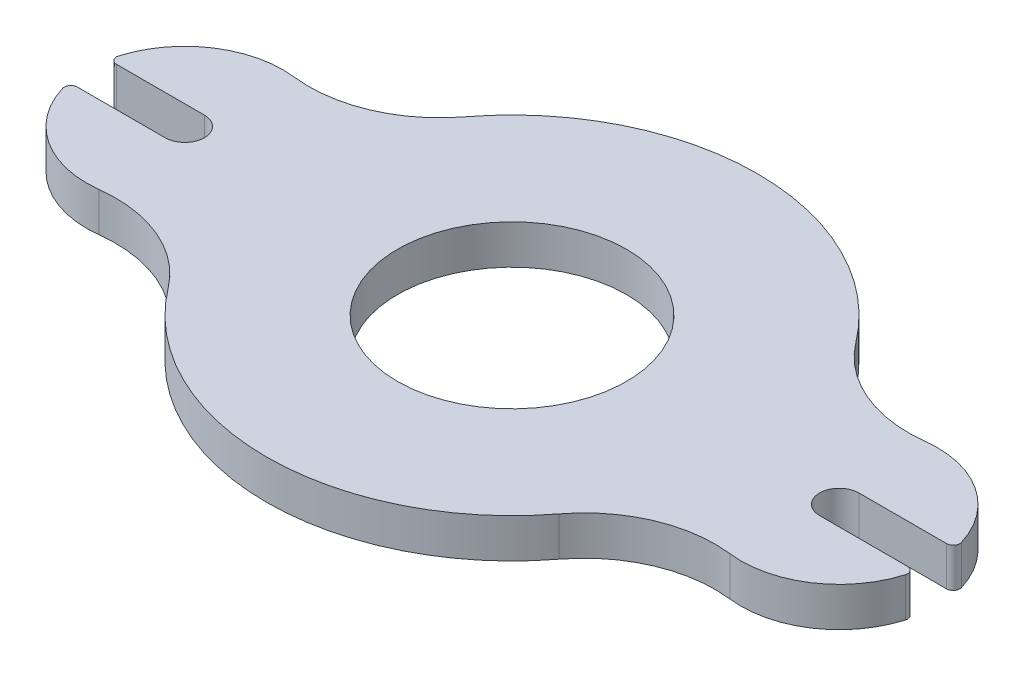
ISO-10303-21;
HEADER;
FILE_DESCRIPTION(('STEP AP214'),'2;1');
FILE_NAME('part.step','',(''),(''),'','','');
FILE_SCHEMA(('AUTOMOTIVE_DESIGN { 1 0 10303 214 1 1 1 1 }'));
ENDSEC;
DATA;
#1=APPLICATION_CONTEXT('core data for automotive mechanical design processes');
#2=APPLICATION_PROTOCOL_DEFINITION('international standard','automotive_design',2000,#1);
#3=PRODUCT_CONTEXT('',#1,'mechanical');
#4=PRODUCT('Part','Part','',(#3));
#5=PRODUCT_RELATED_PRODUCT_CATEGORY('part','',(#4));
#6=PRODUCT_DEFINITION_FORMATION('','',#4);
#7=PRODUCT_DEFINITION_CONTEXT('part definition',#1,'design');
#8=PRODUCT_DEFINITION('design','',#6,#7);
#9=PRODUCT_DEFINITION_SHAPE('','',#8);
#10=(LENGTH_UNIT() NAMED_UNIT(*) SI_UNIT(.MILLI.,.METRE.));
#11=(NAMED_UNIT(*) PLANE_ANGLE_UNIT() SI_UNIT($,.RADIAN.));
#12=(NAMED_UNIT(*) SI_UNIT($,.STERADIAN.) SOLID_ANGLE_UNIT());
#13=UNCERTAINTY_MEASURE_WITH_UNIT(LENGTH_MEASURE(1.E-05),#10,'distance_accuracy_value','');
#14=(GEOMETRIC_REPRESENTATION_CONTEXT(3) GLOBAL_UNCERTAINTY_ASSIGNED_CONTEXT((#13)) GLOBAL_UNIT_ASSIGNED_CONTEXT((#10,
#11,#12)) REPRESENTATION_CONTEXT('',''));
#15=CARTESIAN_POINT('',(0.,0.,0.));
#16=DIRECTION('',(0.,0.,1.));
#17=DIRECTION('',(1.,0.,0.));
#18=AXIS2_PLACEMENT_3D('',#15,#16,#17);
#19=CARTESIAN_POINT('',(50.,6.,0.));
#20=DIRECTION('',(0.,-1.,0.));
#21=DIRECTION('',(0.,0.,-1.));
#22=AXIS2_PLACEMENT_3D('',#19,#20,#21);
#23=PLANE('',#22);
#24=CARTESIAN_POINT('',(50.,6.,0.));
#25=DIRECTION('',(0.,-1.,0.));
#26=DIRECTION('',(0.,0.,-1.));
#27=AXIS2_PLACEMENT_3D('',#24,#25,#26);
#28=CIRCLE('',#27,3.);
#29=CARTESIAN_POINT('',(50.,6.,3.));
#30=VERTEX_POINT('',#29);
#31=CARTESIAN_POINT('',(50.,6.,-3.));
#32=VERTEX_POINT('',#31);
#33=EDGE_CURVE('E240',#30,#32,#28,.T.);
#34=ORIENTED_EDGE('',*,*,#33,.T.);
#35=DIRECTION('',(1.,0.,0.));
#36=VECTOR('',#35,1.);
#37=CARTESIAN_POINT('',(50.,6.,-3.));
#38=LINE('',#37,#36);
#39=CARTESIAN_POINT('',(63.4164078649987,6.,-3.00000000000001));
#40=VERTEX_POINT('',#39);
#41=EDGE_CURVE('E128',#32,#40,#38,.T.);
#42=ORIENTED_EDGE('',*,*,#41,.T.);
#43=CARTESIAN_POINT('',(63.4164078649987,6.,-4.00000000000002));
#44=DIRECTION('',(0.,1.,0.));
#45=DIRECTION('',(0.,0.,-1.));
#46=AXIS2_PLACEMENT_3D('',#43,#44,#45);
#47=CIRCLE('',#46,1.00000000000001);
#48=CARTESIAN_POINT('',(64.3747227124986,6.,-4.2857142857143));
#49=VERTEX_POINT('',#48);
#50=EDGE_CURVE('E291',#40,#49,#47,.T.);
#51=ORIENTED_EDGE('',*,*,#50,.T.);
#52=CARTESIAN_POINT('',(50.,6.,0.));
#53=DIRECTION('',(0.,1.,0.));
#54=DIRECTION('',(0.,0.,-1.));
#55=AXIS2_PLACEMENT_3D('',#52,#53,#54);
#56=CIRCLE('',#55,15.);
#57=CARTESIAN_POINT('',(48.2053571428571,6.,-14.8922549338677));
#58=VERTEX_POINT('',#57);
#59=EDGE_CURVE('E310',#49,#58,#56,.T.);
#60=ORIENTED_EDGE('',*,*,#59,.T.);
#61=CARTESIAN_POINT('',(45.8125,6.,-34.7485948456912));
#62=DIRECTION('',(0.,-1.,0.));
#63=DIRECTION('',(0.,0.,-1.));
#64=AXIS2_PLACEMENT_3D('',#61,#62,#63);
#65=CIRCLE('',#64,20.);
#66=CARTESIAN_POINT('',(29.8777173913043,6.,-22.6621270732769));
#67=VERTEX_POINT('',#66);
#68=EDGE_CURVE('E307',#58,#67,#65,.T.);
#69=ORIENTED_EDGE('',*,*,#68,.T.);
#70=CARTESIAN_POINT('',(0.,6.,0.));
#71=DIRECTION('',(0.,1.,0.));
#72=DIRECTION('',(0.,0.,1.));
#73=AXIS2_PLACEMENT_3D('',#70,#71,#72);
#74=CIRCLE('',#73,37.5);
#75=CARTESIAN_POINT('',(-29.8777173913044,6.,-22.6621270732769));
#76=VERTEX_POINT('',#75);
#77=EDGE_CURVE('E309',#67,#76,#74,.T.);
#78=ORIENTED_EDGE('',*,*,#77,.T.);
#79=CARTESIAN_POINT('',(-45.8125,6.,-34.7485948456912));
#80=DIRECTION('',(0.,-1.,0.));
#81=DIRECTION('',(0.,0.,-1.));
#82=AXIS2_PLACEMENT_3D('',#79,#80,#81);
#83=CIRCLE('',#82,20.);
#84=CARTESIAN_POINT('',(-48.2053571428571,6.,-14.8922549338677));
#85=VERTEX_POINT('',#84);
#86=EDGE_CURVE('E312',#76,#85,#83,.T.);
#87=ORIENTED_EDGE('',*,*,#86,.T.);
#88=CARTESIAN_POINT('',(-50.,6.,0.));
#89=DIRECTION('',(0.,1.,0.));
#90=DIRECTION('',(0.,0.,1.));
#91=AXIS2_PLACEMENT_3D('',#88,#89,#90);
#92=CIRCLE('',#91,15.);
#93=CARTESIAN_POINT('',(-64.3747227124987,6.,-4.28571428571431));
#94=VERTEX_POINT('',#93);
#95=EDGE_CURVE('E318',#85,#94,#92,.T.);
#96=ORIENTED_EDGE('',*,*,#95,.T.);
#97=CARTESIAN_POINT('',(-63.4164078649987,6.,-4.00000000000002));
#98=DIRECTION('',(0.,1.,0.));
#99=DIRECTION('',(0.,0.,1.));
#100=AXIS2_PLACEMENT_3D('',#97,#98,#99);
#101=CIRCLE('',#100,1.00000000000001);
#102=CARTESIAN_POINT('',(-63.4164078649987,6.,-3.));
#103=VERTEX_POINT('',#102);
#104=EDGE_CURVE('E320',#94,#103,#101,.T.);
#105=ORIENTED_EDGE('',*,*,#104,.T.);
#106=DIRECTION('',(1.,0.,0.));
#107=VECTOR('',#106,1.);
#108=CARTESIAN_POINT('',(-50.,6.,-3.));
#109=LINE('',#108,#107);
#110=CARTESIAN_POINT('',(-50.,6.,-3.));
#111=VERTEX_POINT('',#110);
#112=EDGE_CURVE('E322',#103,#111,#109,.T.);
#113=ORIENTED_EDGE('',*,*,#112,.T.);
#114=CARTESIAN_POINT('',(-50.,6.,0.));
#115=DIRECTION('',(0.,-1.,0.));
#116=DIRECTION('',(0.,0.,1.));
#117=AXIS2_PLACEMENT_3D('',#114,#115,#116);
#118=CIRCLE('',#117,3.);
#119=CARTESIAN_POINT('',(-50.,6.,3.));
#120=VERTEX_POINT('',#119);
#121=EDGE_CURVE('E324',#111,#120,#118,.T.);
#122=ORIENTED_EDGE('',*,*,#121,.T.);
#123=DIRECTION('',(-1.,0.,0.));
#124=VECTOR('',#123,1.);
#125=CARTESIAN_POINT('',(-50.,6.,3.));
#126=LINE('',#125,#124);
#127=CARTESIAN_POINT('',(-63.4164078649987,6.,3.));
#128=VERTEX_POINT('',#127);
#129=EDGE_CURVE('E326',#120,#128,#126,.T.);
#130=ORIENTED_EDGE('',*,*,#129,.T.);
#131=CARTESIAN_POINT('',(-63.4164078649987,6.,4.));
#132=DIRECTION('',(0.,1.,0.));
#133=DIRECTION('',(0.,0.,1.));
#134=AXIS2_PLACEMENT_3D('',#131,#132,#133);
#135=CIRCLE('',#134,1.00000000000001);
#136=CARTESIAN_POINT('',(-64.3747227124987,6.,4.28571428571429));
#137=VERTEX_POINT('',#136);
#138=EDGE_CURVE('E328',#128,#137,#135,.T.);
#139=ORIENTED_EDGE('',*,*,#138,.T.);
#140=CARTESIAN_POINT('',(-50.,6.,0.));
#141=DIRECTION('',(0.,1.,0.));
#142=DIRECTION('',(0.,0.,1.));
#143=AXIS2_PLACEMENT_3D('',#140,#141,#142);
#144=CIRCLE('',#143,15.);
#145=CARTESIAN_POINT('',(-48.2053571428571,6.,14.8922549338677));
#146=VERTEX_POINT('',#145);
#147=EDGE_CURVE('E330',#137,#146,#144,.T.);
#148=ORIENTED_EDGE('',*,*,#147,.T.);
#149=CARTESIAN_POINT('',(-45.8125,6.,34.7485948456912));
#150=DIRECTION('',(0.,-1.,0.));
#151=DIRECTION('',(0.,0.,1.));
#152=AXIS2_PLACEMENT_3D('',#149,#150,#151);
#153=CIRCLE('',#152,20.);
#154=CARTESIAN_POINT('',(-29.8777173913044,6.,22.6621270732769));
#155=VERTEX_POINT('',#154);
#156=EDGE_CURVE('E332',#146,#155,#153,.T.);
#157=ORIENTED_EDGE('',*,*,#156,.T.);
#158=CARTESIAN_POINT('',(0.,6.,0.));
#159=DIRECTION('',(0.,1.,0.));
#160=DIRECTION('',(0.,0.,1.));
#161=AXIS2_PLACEMENT_3D('',#158,#159,#160);
#162=CIRCLE('',#161,37.5);
#163=CARTESIAN_POINT('',(29.8777173913043,6.,22.6621270732769));
#164=VERTEX_POINT('',#163);
#165=EDGE_CURVE('E334',#155,#164,#162,.T.);
#166=ORIENTED_EDGE('',*,*,#165,.T.);
#167=CARTESIAN_POINT('',(45.8125,6.,34.7485948456912));
#168=DIRECTION('',(0.,-1.,0.));
#169=DIRECTION('',(0.,0.,-1.));
#170=AXIS2_PLACEMENT_3D('',#167,#168,#169);
#171=CIRCLE('',#170,20.);
#172=CARTESIAN_POINT('',(48.2053571428572,6.,14.8922549338677));
#173=VERTEX_POINT('',#172);
#174=EDGE_CURVE('E183',#164,#173,#171,.T.);
#175=ORIENTED_EDGE('',*,*,#174,.T.);
#176=CARTESIAN_POINT('',(50.,6.,0.));
#177=DIRECTION('',(0.,1.,0.));
#178=DIRECTION('',(0.,0.,-1.));
#179=AXIS2_PLACEMENT_3D('',#176,#177,#178);
#180=CIRCLE('',#179,15.);
#181=CARTESIAN_POINT('',(64.3747227124987,6.,4.28571428571429));
#182=VERTEX_POINT('',#181);
#183=EDGE_CURVE('E177',#173,#182,#180,.T.);
#184=ORIENTED_EDGE('',*,*,#183,.T.);
#185=CARTESIAN_POINT('',(63.4164078649987,6.,4.));
#186=DIRECTION('',(0.,1.,0.));
#187=DIRECTION('',(0.,0.,-1.));
#188=AXIS2_PLACEMENT_3D('',#185,#186,#187);
#189=CIRCLE('',#188,1.00000000000001);
#190=CARTESIAN_POINT('',(63.4164078649987,6.,3.));
#191=VERTEX_POINT('',#190);
#192=EDGE_CURVE('E181',#182,#191,#189,.T.);
#193=ORIENTED_EDGE('',*,*,#192,.T.);
#194=DIRECTION('',(-1.,0.,0.));
#195=VECTOR('',#194,1.);
#196=CARTESIAN_POINT('',(50.,6.,3.));
#197=LINE('',#196,#195);
#198=EDGE_CURVE('E49',#191,#30,#197,.T.);
#199=ORIENTED_EDGE('',*,*,#198,.T.);
#200=EDGE_LOOP('',(#34,#42,#51,#60,#69,#78,#87,#96,#105,#113,#122,#130,#139,#148,#157,#166,#175,
#184,#193,#199));
#201=FACE_BOUND('',#200,.T.);
#202=CARTESIAN_POINT('',(0.,6.,0.));
#203=DIRECTION('',(0.,1.,0.));
#204=DIRECTION('',(0.,0.,1.));
#205=AXIS2_PLACEMENT_3D('',#202,#203,#204);
#206=CIRCLE('',#205,17.5);
#207=CARTESIAN_POINT('',(0.,6.,17.5));
#208=VERTEX_POINT('',#207);
#209=EDGE_CURVE('E205',#208,#208,#206,.T.);
#210=ORIENTED_EDGE('',*,*,#209,.F.);
#211=EDGE_LOOP('',(#210));
#212=FACE_BOUND('',#211,.T.);
#213=ADVANCED_FACE('F32',(#201,#212),#23,.F.);
#214=CARTESIAN_POINT('',(50.,0.,0.));
#215=DIRECTION('',(0.,-1.,0.));
#216=DIRECTION('',(0.,0.,-1.));
#217=AXIS2_PLACEMENT_3D('',#214,#215,#216);
#218=PLANE('',#217);
#219=CARTESIAN_POINT('',(50.,0.,0.));
#220=DIRECTION('',(0.,-1.,0.));
#221=DIRECTION('',(0.,0.,-1.));
#222=AXIS2_PLACEMENT_3D('',#219,#220,#221);
#223=CIRCLE('',#222,3.);
#224=CARTESIAN_POINT('',(50.,0.,3.));
#225=VERTEX_POINT('',#224);
#226=CARTESIAN_POINT('',(50.,0.,-3.));
#227=VERTEX_POINT('',#226);
#228=EDGE_CURVE('E201',#225,#227,#223,.T.);
#229=ORIENTED_EDGE('',*,*,#228,.F.);
#230=DIRECTION('',(-1.,0.,0.));
#231=VECTOR('',#230,1.);
#232=CARTESIAN_POINT('',(50.,0.,3.));
#233=LINE('',#232,#231);
#234=CARTESIAN_POINT('',(63.4164078649987,0.,3.));
#235=VERTEX_POINT('',#234);
#236=EDGE_CURVE('E120',#235,#225,#233,.T.);
#237=ORIENTED_EDGE('',*,*,#236,.F.);
#238=CARTESIAN_POINT('',(63.4164078649987,0.,4.));
#239=DIRECTION('',(0.,1.,0.));
#240=DIRECTION('',(0.,0.,-1.));
#241=AXIS2_PLACEMENT_3D('',#238,#239,#240);
#242=CIRCLE('',#241,1.00000000000001);
#243=CARTESIAN_POINT('',(64.3747227124987,0.,4.28571428571429));
#244=VERTEX_POINT('',#243);
#245=EDGE_CURVE('E114',#244,#235,#242,.T.);
#246=ORIENTED_EDGE('',*,*,#245,.F.);
#247=CARTESIAN_POINT('',(50.,0.,0.));
#248=DIRECTION('',(0.,1.,0.));
#249=DIRECTION('',(0.,0.,-1.));
#250=AXIS2_PLACEMENT_3D('',#247,#248,#249);
#251=CIRCLE('',#250,15.);
#252=CARTESIAN_POINT('',(48.2053571428572,0.,14.8922549338677));
#253=VERTEX_POINT('',#252);
#254=EDGE_CURVE('E191',#253,#244,#251,.T.);
#255=ORIENTED_EDGE('',*,*,#254,.F.);
#256=CARTESIAN_POINT('',(45.8125,0.,34.7485948456912));
#257=DIRECTION('',(0.,-1.,0.));
#258=DIRECTION('',(0.,0.,-1.));
#259=AXIS2_PLACEMENT_3D('',#256,#257,#258);
#260=CIRCLE('',#259,20.);
#261=CARTESIAN_POINT('',(29.8777173913043,0.,22.6621270732769));
#262=VERTEX_POINT('',#261);
#263=EDGE_CURVE('E235',#262,#253,#260,.T.);
#264=ORIENTED_EDGE('',*,*,#263,.F.);
#265=CARTESIAN_POINT('',(0.,0.,0.));
#266=DIRECTION('',(0.,1.,0.));
#267=DIRECTION('',(0.,0.,1.));
#268=AXIS2_PLACEMENT_3D('',#265,#266,#267);
#269=CIRCLE('',#268,37.5);
#270=CARTESIAN_POINT('',(-29.8777173913044,0.,22.6621270732769));
#271=VERTEX_POINT('',#270);
#272=EDGE_CURVE('E233',#271,#262,#269,.T.);
#273=ORIENTED_EDGE('',*,*,#272,.F.);
#274=CARTESIAN_POINT('',(-45.8125,0.,34.7485948456912));
#275=DIRECTION('',(0.,-1.,0.));
#276=DIRECTION('',(0.,0.,1.));
#277=AXIS2_PLACEMENT_3D('',#274,#275,#276);
#278=CIRCLE('',#277,20.);
#279=CARTESIAN_POINT('',(-48.2053571428571,0.,14.8922549338677));
#280=VERTEX_POINT('',#279);
#281=EDGE_CURVE('E231',#280,#271,#278,.T.);
#282=ORIENTED_EDGE('',*,*,#281,.F.);
#283=CARTESIAN_POINT('',(-50.,0.,0.));
#284=DIRECTION('',(0.,1.,0.));
#285=DIRECTION('',(0.,0.,1.));
#286=AXIS2_PLACEMENT_3D('',#283,#284,#285);
#287=CIRCLE('',#286,15.);
#288=CARTESIAN_POINT('',(-64.3747227124987,0.,4.28571428571429));
#289=VERTEX_POINT('',#288);
#290=EDGE_CURVE('E229',#289,#280,#287,.T.);
#291=ORIENTED_EDGE('',*,*,#290,.F.);
#292=CARTESIAN_POINT('',(-63.4164078649987,0.,4.));
#293=DIRECTION('',(0.,1.,0.));
#294=DIRECTION('',(0.,0.,1.));
#295=AXIS2_PLACEMENT_3D('',#292,#293,#294);
#296=CIRCLE('',#295,1.00000000000001);
#297=CARTESIAN_POINT('',(-63.4164078649987,0.,3.));
#298=VERTEX_POINT('',#297);
#299=EDGE_CURVE('E227',#298,#289,#296,.T.);
#300=ORIENTED_EDGE('',*,*,#299,.F.);
#301=DIRECTION('',(-1.,0.,0.));
#302=VECTOR('',#301,1.);
#303=CARTESIAN_POINT('',(-50.,0.,3.));
#304=LINE('',#303,#302);
#305=CARTESIAN_POINT('',(-50.,0.,3.));
#306=VERTEX_POINT('',#305);
#307=EDGE_CURVE('E225',#306,#298,#304,.T.);
#308=ORIENTED_EDGE('',*,*,#307,.F.);
#309=CARTESIAN_POINT('',(-50.,0.,0.));
#310=DIRECTION('',(0.,-1.,0.));
#311=DIRECTION('',(0.,0.,1.));
#312=AXIS2_PLACEMENT_3D('',#309,#310,#311);
#313=CIRCLE('',#312,3.);
#314=CARTESIAN_POINT('',(-50.,0.,-3.));
#315=VERTEX_POINT('',#314);
#316=EDGE_CURVE('E223',#315,#306,#313,.T.);
#317=ORIENTED_EDGE('',*,*,#316,.F.);
#318=DIRECTION('',(1.,0.,0.));
#319=VECTOR('',#318,1.);
#320=CARTESIAN_POINT('',(-50.,0.,-3.));
#321=LINE('',#320,#319);
#322=CARTESIAN_POINT('',(-63.4164078649987,0.,-3.));
#323=VERTEX_POINT('',#322);
#324=EDGE_CURVE('E221',#323,#315,#321,.T.);
#325=ORIENTED_EDGE('',*,*,#324,.F.);
#326=CARTESIAN_POINT('',(-63.4164078649987,0.,-4.00000000000002));
#327=DIRECTION('',(0.,1.,0.));
#328=DIRECTION('',(0.,0.,1.));
#329=AXIS2_PLACEMENT_3D('',#326,#327,#328);
#330=CIRCLE('',#329,1.00000000000001);
#331=CARTESIAN_POINT('',(-64.3747227124987,0.,-4.28571428571431));
#332=VERTEX_POINT('',#331);
#333=EDGE_CURVE('E219',#332,#323,#330,.T.);
#334=ORIENTED_EDGE('',*,*,#333,.F.);
#335=CARTESIAN_POINT('',(-50.,0.,0.));
#336=DIRECTION('',(0.,1.,0.));
#337=DIRECTION('',(0.,0.,1.));
#338=AXIS2_PLACEMENT_3D('',#335,#336,#337);
#339=CIRCLE('',#338,15.);
#340=CARTESIAN_POINT('',(-48.2053571428571,0.,-14.8922549338677));
#341=VERTEX_POINT('',#340);
#342=EDGE_CURVE('E217',#341,#332,#339,.T.);
#343=ORIENTED_EDGE('',*,*,#342,.F.);
#344=CARTESIAN_POINT('',(-45.8125,0.,-34.7485948456912));
#345=DIRECTION('',(0.,-1.,0.));
#346=DIRECTION('',(0.,0.,-1.));
#347=AXIS2_PLACEMENT_3D('',#344,#345,#346);
#348=CIRCLE('',#347,20.);
#349=CARTESIAN_POINT('',(-29.8777173913044,0.,-22.6621270732769));
#350=VERTEX_POINT('',#349);
#351=EDGE_CURVE('E215',#350,#341,#348,.T.);
#352=ORIENTED_EDGE('',*,*,#351,.F.);
#353=CARTESIAN_POINT('',(0.,0.,0.));
#354=DIRECTION('',(0.,1.,0.));
#355=DIRECTION('',(0.,0.,1.));
#356=AXIS2_PLACEMENT_3D('',#353,#354,#355);
#357=CIRCLE('',#356,37.5);
#358=CARTESIAN_POINT('',(29.8777173913043,0.,-22.6621270732769));
#359=VERTEX_POINT('',#358);
#360=EDGE_CURVE('E213',#359,#350,#357,.T.);
#361=ORIENTED_EDGE('',*,*,#360,.F.);
#362=CARTESIAN_POINT('',(45.8125,0.,-34.7485948456912));
#363=DIRECTION('',(0.,-1.,0.));
#364=DIRECTION('',(0.,0.,-1.));
#365=AXIS2_PLACEMENT_3D('',#362,#363,#364);
#366=CIRCLE('',#365,20.);
#367=CARTESIAN_POINT('',(48.2053571428571,0.,-14.8922549338677));
#368=VERTEX_POINT('',#367);
#369=EDGE_CURVE('E211',#368,#359,#366,.T.);
#370=ORIENTED_EDGE('',*,*,#369,.F.);
#371=CARTESIAN_POINT('',(50.,0.,0.));
#372=DIRECTION('',(0.,1.,0.));
#373=DIRECTION('',(0.,0.,-1.));
#374=AXIS2_PLACEMENT_3D('',#371,#372,#373);
#375=CIRCLE('',#374,15.);
#376=CARTESIAN_POINT('',(64.3747227124986,0.,-4.2857142857143));
#377=VERTEX_POINT('',#376);
#378=EDGE_CURVE('E209',#377,#368,#375,.T.);
#379=ORIENTED_EDGE('',*,*,#378,.F.);
#380=CARTESIAN_POINT('',(63.4164078649987,0.,-4.00000000000002));
#381=DIRECTION('',(0.,1.,0.));
#382=DIRECTION('',(0.,0.,-1.));
#383=AXIS2_PLACEMENT_3D('',#380,#381,#382);
#384=CIRCLE('',#383,1.00000000000001);
#385=CARTESIAN_POINT('',(63.4164078649987,0.,-3.00000000000001));
#386=VERTEX_POINT('',#385);
#387=EDGE_CURVE('E207',#386,#377,#384,.T.);
#388=ORIENTED_EDGE('',*,*,#387,.F.);
#389=DIRECTION('',(1.,0.,0.));
#390=VECTOR('',#389,1.);
#391=CARTESIAN_POINT('',(50.,0.,-3.));
#392=LINE('',#391,#390);
#393=EDGE_CURVE('E204',#227,#386,#392,.T.);
#394=ORIENTED_EDGE('',*,*,#393,.F.);
#395=EDGE_LOOP('',(#229,#237,#246,#255,#264,#273,#282,#291,#300,#308,#317,#325,#334,#343,#352,
#361,#370,#379,#388,#394));
#396=FACE_BOUND('',#395,.T.);
#397=CARTESIAN_POINT('',(0.,0.,0.));
#398=DIRECTION('',(0.,1.,0.));
#399=DIRECTION('',(0.,0.,1.));
#400=AXIS2_PLACEMENT_3D('',#397,#398,#399);
#401=CIRCLE('',#400,17.5);
#402=CARTESIAN_POINT('',(0.,0.,17.5));
#403=VERTEX_POINT('',#402);
#404=EDGE_CURVE('E585',#403,#403,#401,.T.);
#405=ORIENTED_EDGE('',*,*,#404,.T.);
#406=EDGE_LOOP('',(#405));
#407=FACE_BOUND('',#406,.T.);
#408=ADVANCED_FACE('F295',(#396,#407),#218,.T.);
#409=CARTESIAN_POINT('',(50.,6.,0.));
#410=DIRECTION('',(0.,-1.,0.));
#411=DIRECTION('',(0.,0.,-1.));
#412=AXIS2_PLACEMENT_3D('',#409,#410,#411);
#413=CYLINDRICAL_SURFACE('',#412,3.);
#414=ORIENTED_EDGE('',*,*,#228,.T.);
#415=DIRECTION('',(0.,-1.,0.));
#416=VECTOR('',#415,1.);
#417=CARTESIAN_POINT('',(50.,6.,-3.));
#418=LINE('',#417,#416);
#419=EDGE_CURVE('E11',#32,#227,#418,.T.);
#420=ORIENTED_EDGE('',*,*,#419,.F.);
#421=ORIENTED_EDGE('',*,*,#33,.F.);
#422=DIRECTION('',(0.,-1.,0.));
#423=VECTOR('',#422,1.);
#424=CARTESIAN_POINT('',(50.,6.,3.));
#425=LINE('',#424,#423);
#426=EDGE_CURVE('E197',#30,#225,#425,.T.);
#427=ORIENTED_EDGE('',*,*,#426,.T.);
#428=EDGE_LOOP('',(#414,#420,#421,#427));
#429=FACE_BOUND('',#428,.T.);
#430=ADVANCED_FACE('F34',(#429),#413,.F.);
#431=CARTESIAN_POINT('',(50.,6.,-3.));
#432=DIRECTION('',(0.,0.,-1.));
#433=DIRECTION('',(-1.,0.,0.));
#434=AXIS2_PLACEMENT_3D('',#431,#432,#433);
#435=PLANE('',#434);
#436=ORIENTED_EDGE('',*,*,#393,.T.);
#437=DIRECTION('',(0.,-1.,0.));
#438=VECTOR('',#437,1.);
#439=CARTESIAN_POINT('',(63.4164078649987,6.,-3.00000000000001));
#440=LINE('',#439,#438);
#441=EDGE_CURVE('E41',#40,#386,#440,.T.);
#442=ORIENTED_EDGE('',*,*,#441,.F.);
#443=ORIENTED_EDGE('',*,*,#41,.F.);
#444=ORIENTED_EDGE('',*,*,#419,.T.);
#445=EDGE_LOOP('',(#436,#442,#443,#444));
#446=FACE_BOUND('',#445,.T.);
#447=ADVANCED_FACE('F368',(#446),#435,.F.);
#448=CARTESIAN_POINT('',(63.4164078649987,6.,-4.00000000000002));
#449=DIRECTION('',(0.,-1.,0.));
#450=DIRECTION('',(0.,0.,-1.));
#451=AXIS2_PLACEMENT_3D('',#448,#449,#450);
#452=CYLINDRICAL_SURFACE('',#451,1.00000000000001);
#453=ORIENTED_EDGE('',*,*,#387,.T.);
#454=DIRECTION('',(0.,-1.,0.));
#455=VECTOR('',#454,1.);
#456=CARTESIAN_POINT('',(64.3747227124986,6.,-4.2857142857143));
#457=LINE('',#456,#455);
#458=EDGE_CURVE('E283',#49,#377,#457,.T.);
#459=ORIENTED_EDGE('',*,*,#458,.F.);
#460=ORIENTED_EDGE('',*,*,#50,.F.);
#461=ORIENTED_EDGE('',*,*,#441,.T.);
#462=EDGE_LOOP('',(#453,#459,#460,#461));
#463=FACE_BOUND('',#462,.T.);
#464=ADVANCED_FACE('F289',(#463),#452,.T.);
#465=CARTESIAN_POINT('',(50.,6.,0.));
#466=DIRECTION('',(0.,-1.,0.));
#467=DIRECTION('',(0.,0.,-1.));
#468=AXIS2_PLACEMENT_3D('',#465,#466,#467);
#469=CYLINDRICAL_SURFACE('',#468,15.);
#470=ORIENTED_EDGE('',*,*,#378,.T.);
#471=DIRECTION('',(0.,-1.,0.));
#472=VECTOR('',#471,1.);
#473=CARTESIAN_POINT('',(48.2053571428571,6.,-14.8922549338677));
#474=LINE('',#473,#472);
#475=EDGE_CURVE('E280',#58,#368,#474,.T.);
#476=ORIENTED_EDGE('',*,*,#475,.F.);
#477=ORIENTED_EDGE('',*,*,#59,.F.);
#478=ORIENTED_EDGE('',*,*,#458,.T.);
#479=EDGE_LOOP('',(#470,#476,#477,#478));
#480=FACE_BOUND('',#479,.T.);
#481=ADVANCED_FACE('F301',(#480),#469,.T.);
#482=CARTESIAN_POINT('',(45.8125,6.,-34.7485948456912));
#483=DIRECTION('',(0.,-1.,0.));
#484=DIRECTION('',(0.,0.,-1.));
#485=AXIS2_PLACEMENT_3D('',#482,#483,#484);
#486=CYLINDRICAL_SURFACE('',#485,20.);
#487=ORIENTED_EDGE('',*,*,#369,.T.);
#488=DIRECTION('',(0.,-1.,0.));
#489=VECTOR('',#488,1.);
#490=CARTESIAN_POINT('',(29.8777173913043,6.,-22.6621270732769));
#491=LINE('',#490,#489);
#492=EDGE_CURVE('E277',#67,#359,#491,.T.);
#493=ORIENTED_EDGE('',*,*,#492,.F.);
#494=ORIENTED_EDGE('',*,*,#68,.F.);
#495=ORIENTED_EDGE('',*,*,#475,.T.);
#496=EDGE_LOOP('',(#487,#493,#494,#495));
#497=FACE_BOUND('',#496,.T.);
#498=ADVANCED_FACE('F305',(#497),#486,.F.);
#499=CARTESIAN_POINT('',(0.,6.,0.));
#500=DIRECTION('',(0.,-1.,0.));
#501=DIRECTION('',(0.,0.,-1.));
#502=AXIS2_PLACEMENT_3D('',#499,#500,#501);
#503=CYLINDRICAL_SURFACE('',#502,37.5);
#504=ORIENTED_EDGE('',*,*,#360,.T.);
#505=DIRECTION('',(0.,-1.,0.));
#506=VECTOR('',#505,1.);
#507=CARTESIAN_POINT('',(-29.8777173913044,6.,-22.6621270732769));
#508=LINE('',#507,#506);
#509=EDGE_CURVE('E274',#76,#350,#508,.T.);
#510=ORIENTED_EDGE('',*,*,#509,.F.);
#511=ORIENTED_EDGE('',*,*,#77,.F.);
#512=ORIENTED_EDGE('',*,*,#492,.T.);
#513=EDGE_LOOP('',(#504,#510,#511,#512));
#514=FACE_BOUND('',#513,.T.);
#515=ADVANCED_FACE('F381',(#514),#503,.T.);
#516=CARTESIAN_POINT('',(-45.8125,6.,-34.7485948456912));
#517=DIRECTION('',(0.,-1.,0.));
#518=DIRECTION('',(0.,0.,-1.));
#519=AXIS2_PLACEMENT_3D('',#516,#517,#518);
#520=CYLINDRICAL_SURFACE('',#519,20.);
#521=ORIENTED_EDGE('',*,*,#351,.T.);
#522=DIRECTION('',(0.,-1.,0.));
#523=VECTOR('',#522,1.);
#524=CARTESIAN_POINT('',(-48.2053571428571,6.,-14.8922549338677));
#525=LINE('',#524,#523);
#526=EDGE_CURVE('E271',#85,#341,#525,.T.);
#527=ORIENTED_EDGE('',*,*,#526,.F.);
#528=ORIENTED_EDGE('',*,*,#86,.F.);
#529=ORIENTED_EDGE('',*,*,#509,.T.);
#530=EDGE_LOOP('',(#521,#527,#528,#529));
#531=FACE_BOUND('',#530,.T.);
#532=ADVANCED_FACE('F384',(#531),#520,.F.);
#533=CARTESIAN_POINT('',(-50.,6.,0.));
#534=DIRECTION('',(0.,-1.,0.));
#535=DIRECTION('',(0.,0.,-1.));
#536=AXIS2_PLACEMENT_3D('',#533,#534,#535);
#537=CYLINDRICAL_SURFACE('',#536,15.);
#538=ORIENTED_EDGE('',*,*,#342,.T.);
#539=DIRECTION('',(0.,-1.,0.));
#540=VECTOR('',#539,1.);
#541=CARTESIAN_POINT('',(-64.3747227124987,6.,-4.28571428571431));
#542=LINE('',#541,#540);
#543=EDGE_CURVE('E268',#94,#332,#542,.T.);
#544=ORIENTED_EDGE('',*,*,#543,.F.);
#545=ORIENTED_EDGE('',*,*,#95,.F.);
#546=ORIENTED_EDGE('',*,*,#526,.T.);
#547=EDGE_LOOP('',(#538,#544,#545,#546));
#548=FACE_BOUND('',#547,.T.);
#549=ADVANCED_FACE('F388',(#548),#537,.T.);
#550=CARTESIAN_POINT('',(-63.4164078649987,6.,-4.00000000000002));
#551=DIRECTION('',(0.,-1.,0.));
#552=DIRECTION('',(0.,0.,-1.));
#553=AXIS2_PLACEMENT_3D('',#550,#551,#552);
#554=CYLINDRICAL_SURFACE('',#553,1.00000000000001);
#555=ORIENTED_EDGE('',*,*,#333,.T.);
#556=DIRECTION('',(0.,-1.,0.));
#557=VECTOR('',#556,1.);
#558=CARTESIAN_POINT('',(-63.4164078649987,6.,-3.));
#559=LINE('',#558,#557);
#560=EDGE_CURVE('E265',#103,#323,#559,.T.);
#561=ORIENTED_EDGE('',*,*,#560,.F.);
#562=ORIENTED_EDGE('',*,*,#104,.F.);
#563=ORIENTED_EDGE('',*,*,#543,.T.);
#564=EDGE_LOOP('',(#555,#561,#562,#563));
#565=FACE_BOUND('',#564,.T.);
#566=ADVANCED_FACE('F392',(#565),#554,.T.);
#567=CARTESIAN_POINT('',(-50.,6.,-3.));
#568=DIRECTION('',(0.,0.,-1.));
#569=DIRECTION('',(-1.,0.,0.));
#570=AXIS2_PLACEMENT_3D('',#567,#568,#569);
#571=PLANE('',#570);
#572=ORIENTED_EDGE('',*,*,#324,.T.);
#573=DIRECTION('',(0.,-1.,0.));
#574=VECTOR('',#573,1.);
#575=CARTESIAN_POINT('',(-50.,6.,-3.));
#576=LINE('',#575,#574);
#577=EDGE_CURVE('E262',#111,#315,#576,.T.);
#578=ORIENTED_EDGE('',*,*,#577,.F.);
#579=ORIENTED_EDGE('',*,*,#112,.F.);
#580=ORIENTED_EDGE('',*,*,#560,.T.);
#581=EDGE_LOOP('',(#572,#578,#579,#580));
#582=FACE_BOUND('',#581,.T.);
#583=ADVANCED_FACE('F396',(#582),#571,.F.);
#584=CARTESIAN_POINT('',(-50.,6.,0.));
#585=DIRECTION('',(0.,-1.,0.));
#586=DIRECTION('',(0.,0.,-1.));
#587=AXIS2_PLACEMENT_3D('',#584,#585,#586);
#588=CYLINDRICAL_SURFACE('',#587,3.);
#589=ORIENTED_EDGE('',*,*,#316,.T.);
#590=DIRECTION('',(0.,-1.,0.));
#591=VECTOR('',#590,1.);
#592=CARTESIAN_POINT('',(-50.,6.,3.));
#593=LINE('',#592,#591);
#594=EDGE_CURVE('E259',#120,#306,#593,.T.);
#595=ORIENTED_EDGE('',*,*,#594,.F.);
#596=ORIENTED_EDGE('',*,*,#121,.F.);
#597=ORIENTED_EDGE('',*,*,#577,.T.);
#598=EDGE_LOOP('',(#589,#595,#596,#597));
#599=FACE_BOUND('',#598,.T.);
#600=ADVANCED_FACE('F400',(#599),#588,.F.);
#601=CARTESIAN_POINT('',(-50.,6.,3.));
#602=DIRECTION('',(0.,0.,1.));
#603=DIRECTION('',(1.,0.,0.));
#604=AXIS2_PLACEMENT_3D('',#601,#602,#603);
#605=PLANE('',#604);
#606=ORIENTED_EDGE('',*,*,#307,.T.);
#607=DIRECTION('',(0.,-1.,0.));
#608=VECTOR('',#607,1.);
#609=CARTESIAN_POINT('',(-63.4164078649987,6.,3.));
#610=LINE('',#609,#608);
#611=EDGE_CURVE('E256',#128,#298,#610,.T.);
#612=ORIENTED_EDGE('',*,*,#611,.F.);
#613=ORIENTED_EDGE('',*,*,#129,.F.);
#614=ORIENTED_EDGE('',*,*,#594,.T.);
#615=EDGE_LOOP('',(#606,#612,#613,#614));
#616=FACE_BOUND('',#615,.T.);
#617=ADVANCED_FACE('F404',(#616),#605,.F.);
#618=CARTESIAN_POINT('',(-63.4164078649987,6.,4.));
#619=DIRECTION('',(0.,-1.,0.));
#620=DIRECTION('',(0.,0.,-1.));
#621=AXIS2_PLACEMENT_3D('',#618,#619,#620);
#622=CYLINDRICAL_SURFACE('',#621,1.00000000000001);
#623=ORIENTED_EDGE('',*,*,#299,.T.);
#624=DIRECTION('',(0.,-1.,0.));
#625=VECTOR('',#624,1.);
#626=CARTESIAN_POINT('',(-64.3747227124987,6.,4.28571428571429));
#627=LINE('',#626,#625);
#628=EDGE_CURVE('E253',#137,#289,#627,.T.);
#629=ORIENTED_EDGE('',*,*,#628,.F.);
#630=ORIENTED_EDGE('',*,*,#138,.F.);
#631=ORIENTED_EDGE('',*,*,#611,.T.);
#632=EDGE_LOOP('',(#623,#629,#630,#631));
#633=FACE_BOUND('',#632,.T.);
#634=ADVANCED_FACE('F408',(#633),#622,.T.);
#635=CARTESIAN_POINT('',(-50.,6.,0.));
#636=DIRECTION('',(0.,-1.,0.));
#637=DIRECTION('',(0.,0.,-1.));
#638=AXIS2_PLACEMENT_3D('',#635,#636,#637);
#639=CYLINDRICAL_SURFACE('',#638,15.);
#640=ORIENTED_EDGE('',*,*,#290,.T.);
#641=DIRECTION('',(0.,-1.,0.));
#642=VECTOR('',#641,1.);
#643=CARTESIAN_POINT('',(-48.2053571428571,6.,14.8922549338677));
#644=LINE('',#643,#642);
#645=EDGE_CURVE('E250',#146,#280,#644,.T.);
#646=ORIENTED_EDGE('',*,*,#645,.F.);
#647=ORIENTED_EDGE('',*,*,#147,.F.);
#648=ORIENTED_EDGE('',*,*,#628,.T.);
#649=EDGE_LOOP('',(#640,#646,#647,#648));
#650=FACE_BOUND('',#649,.T.);
#651=ADVANCED_FACE('F412',(#650),#639,.T.);
#652=CARTESIAN_POINT('',(-45.8125,6.,34.7485948456912));
#653=DIRECTION('',(0.,-1.,0.));
#654=DIRECTION('',(0.,0.,-1.));
#655=AXIS2_PLACEMENT_3D('',#652,#653,#654);
#656=CYLINDRICAL_SURFACE('',#655,20.);
#657=ORIENTED_EDGE('',*,*,#281,.T.);
#658=DIRECTION('',(0.,-1.,0.));
#659=VECTOR('',#658,1.);
#660=CARTESIAN_POINT('',(-29.8777173913044,6.,22.6621270732769));
#661=LINE('',#660,#659);
#662=EDGE_CURVE('E247',#155,#271,#661,.T.);
#663=ORIENTED_EDGE('',*,*,#662,.F.);
#664=ORIENTED_EDGE('',*,*,#156,.F.);
#665=ORIENTED_EDGE('',*,*,#645,.T.);
#666=EDGE_LOOP('',(#657,#663,#664,#665));
#667=FACE_BOUND('',#666,.T.);
#668=ADVANCED_FACE('F416',(#667),#656,.F.);
#669=CARTESIAN_POINT('',(0.,6.,0.));
#670=DIRECTION('',(0.,-1.,0.));
#671=DIRECTION('',(0.,0.,-1.));
#672=AXIS2_PLACEMENT_3D('',#669,#670,#671);
#673=CYLINDRICAL_SURFACE('',#672,37.5);
#674=ORIENTED_EDGE('',*,*,#272,.T.);
#675=DIRECTION('',(0.,-1.,0.));
#676=VECTOR('',#675,1.);
#677=CARTESIAN_POINT('',(29.8777173913043,6.,22.6621270732769));
#678=LINE('',#677,#676);
#679=EDGE_CURVE('E244',#164,#262,#678,.T.);
#680=ORIENTED_EDGE('',*,*,#679,.F.);
#681=ORIENTED_EDGE('',*,*,#165,.F.);
#682=ORIENTED_EDGE('',*,*,#662,.T.);
#683=EDGE_LOOP('',(#674,#680,#681,#682));
#684=FACE_BOUND('',#683,.T.);
#685=ADVANCED_FACE('F340',(#684),#673,.T.);
#686=CARTESIAN_POINT('',(45.8125,6.,34.7485948456912));
#687=DIRECTION('',(0.,-1.,0.));
#688=DIRECTION('',(0.,0.,-1.));
#689=AXIS2_PLACEMENT_3D('',#686,#687,#688);
#690=CYLINDRICAL_SURFACE('',#689,20.);
#691=ORIENTED_EDGE('',*,*,#263,.T.);
#692=DIRECTION('',(0.,-1.,0.));
#693=VECTOR('',#692,1.);
#694=CARTESIAN_POINT('',(48.2053571428572,6.,14.8922549338677));
#695=LINE('',#694,#693);
#696=EDGE_CURVE('E192',#173,#253,#695,.T.);
#697=ORIENTED_EDGE('',*,*,#696,.F.);
#698=ORIENTED_EDGE('',*,*,#174,.F.);
#699=ORIENTED_EDGE('',*,*,#679,.T.);
#700=EDGE_LOOP('',(#691,#697,#698,#699));
#701=FACE_BOUND('',#700,.T.);
#702=ADVANCED_FACE('F344',(#701),#690,.F.);
#703=CARTESIAN_POINT('',(50.,6.,0.));
#704=DIRECTION('',(0.,-1.,0.));
#705=DIRECTION('',(0.,0.,-1.));
#706=AXIS2_PLACEMENT_3D('',#703,#704,#705);
#707=CYLINDRICAL_SURFACE('',#706,15.);
#708=ORIENTED_EDGE('',*,*,#254,.T.);
#709=DIRECTION('',(0.,-1.,0.));
#710=VECTOR('',#709,1.);
#711=CARTESIAN_POINT('',(64.3747227124987,6.,4.28571428571429));
#712=LINE('',#711,#710);
#713=EDGE_CURVE('E188',#182,#244,#712,.T.);
#714=ORIENTED_EDGE('',*,*,#713,.F.);
#715=ORIENTED_EDGE('',*,*,#183,.F.);
#716=ORIENTED_EDGE('',*,*,#696,.T.);
#717=EDGE_LOOP('',(#708,#714,#715,#716));
#718=FACE_BOUND('',#717,.T.);
#719=ADVANCED_FACE('F189',(#718),#707,.T.);
#720=CARTESIAN_POINT('',(63.4164078649987,6.,4.));
#721=DIRECTION('',(0.,-1.,0.));
#722=DIRECTION('',(0.,0.,-1.));
#723=AXIS2_PLACEMENT_3D('',#720,#721,#722);
#724=CYLINDRICAL_SURFACE('',#723,1.00000000000001);
#725=ORIENTED_EDGE('',*,*,#245,.T.);
#726=DIRECTION('',(0.,-1.,0.));
#727=VECTOR('',#726,1.);
#728=CARTESIAN_POINT('',(63.4164078649987,6.,3.));
#729=LINE('',#728,#727);
#730=EDGE_CURVE('E193',#191,#235,#729,.T.);
#731=ORIENTED_EDGE('',*,*,#730,.F.);
#732=ORIENTED_EDGE('',*,*,#192,.F.);
#733=ORIENTED_EDGE('',*,*,#713,.T.);
#734=EDGE_LOOP('',(#725,#731,#732,#733));
#735=FACE_BOUND('',#734,.T.);
#736=ADVANCED_FACE('F195',(#735),#724,.T.);
#737=CARTESIAN_POINT('',(50.,6.,3.));
#738=DIRECTION('',(0.,0.,1.));
#739=DIRECTION('',(1.,0.,0.));
#740=AXIS2_PLACEMENT_3D('',#737,#738,#739);
#741=PLANE('',#740);
#742=ORIENTED_EDGE('',*,*,#236,.T.);
#743=ORIENTED_EDGE('',*,*,#426,.F.);
#744=ORIENTED_EDGE('',*,*,#198,.F.);
#745=ORIENTED_EDGE('',*,*,#730,.T.);
#746=EDGE_LOOP('',(#742,#743,#744,#745));
#747=FACE_BOUND('',#746,.T.);
#748=ADVANCED_FACE('F348',(#747),#741,.F.);
#749=CARTESIAN_POINT('',(0.,6.,0.));
#750=DIRECTION('',(0.,-1.,0.));
#751=DIRECTION('',(0.,0.,-1.));
#752=AXIS2_PLACEMENT_3D('',#749,#750,#751);
#753=CYLINDRICAL_SURFACE('',#752,17.5);
#754=ORIENTED_EDGE('',*,*,#209,.T.);
#755=EDGE_LOOP('',(#754));
#756=FACE_BOUND('',#755,.T.);
#757=ORIENTED_EDGE('',*,*,#404,.F.);
#758=EDGE_LOOP('',(#757));
#759=FACE_BOUND('',#758,.T.);
#760=ADVANCED_FACE('F350',(#756,#759),#753,.F.);
#761=CLOSED_SHELL('',(#213,#408,#430,#447,#464,#481,#498,#515,#532,#549,#566,#583,#600,#617,
#634,#651,#668,#685,#702,#719,#736,#748,#760));
#762=MANIFOLD_SOLID_BREP('B2',#761);
#763=ADVANCED_BREP_SHAPE_REPRESENTATION('',(#18,#762),#14);
#764=SHAPE_DEFINITION_REPRESENTATION(#9,#763);
ENDSEC;
END-ISO-10303-21;
